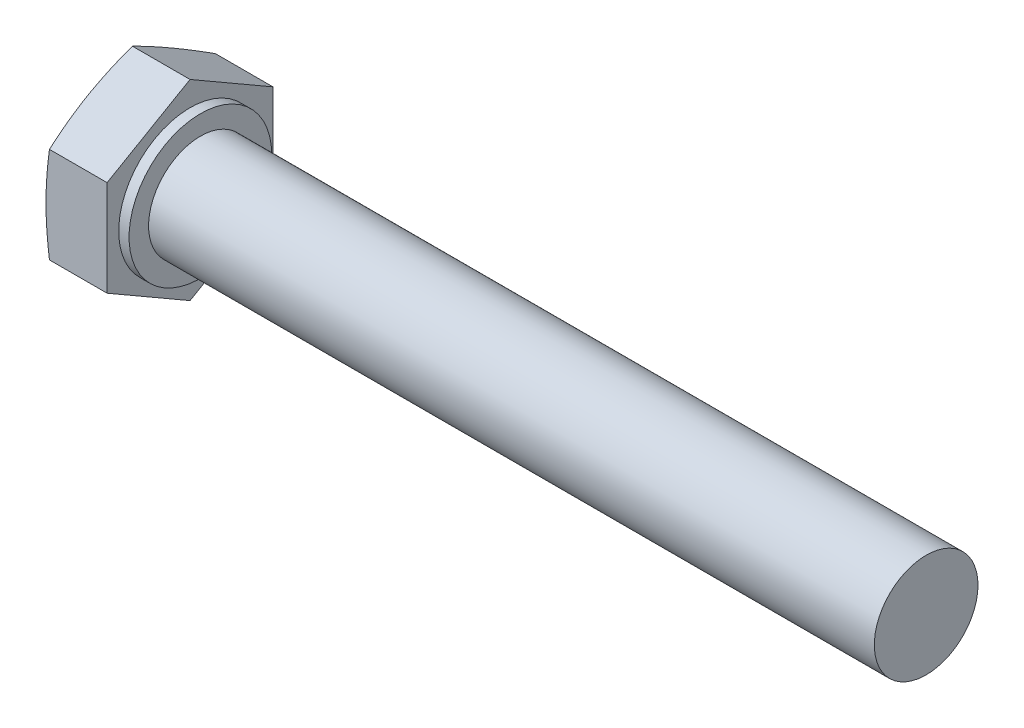
ISO-10303-21;
HEADER;
FILE_DESCRIPTION(('STEP AP214'),'2;1');
FILE_NAME('part.step','',(''),(''),'','','');
FILE_SCHEMA(('AUTOMOTIVE_DESIGN { 1 0 10303 214 1 1 1 1 }'));
ENDSEC;
DATA;
#1=APPLICATION_CONTEXT('core data for automotive mechanical design processes');
#2=APPLICATION_PROTOCOL_DEFINITION('international standard','automotive_design',2000,#1);
#3=PRODUCT_CONTEXT('',#1,'mechanical');
#4=PRODUCT('Part','Part','',(#3));
#5=PRODUCT_RELATED_PRODUCT_CATEGORY('part','',(#4));
#6=PRODUCT_DEFINITION_FORMATION('','',#4);
#7=PRODUCT_DEFINITION_CONTEXT('part definition',#1,'design');
#8=PRODUCT_DEFINITION('design','',#6,#7);
#9=PRODUCT_DEFINITION_SHAPE('','',#8);
#10=(LENGTH_UNIT() NAMED_UNIT(*) SI_UNIT(.MILLI.,.METRE.));
#11=(NAMED_UNIT(*) PLANE_ANGLE_UNIT() SI_UNIT($,.RADIAN.));
#12=(NAMED_UNIT(*) SI_UNIT($,.STERADIAN.) SOLID_ANGLE_UNIT());
#13=UNCERTAINTY_MEASURE_WITH_UNIT(LENGTH_MEASURE(1.E-05),#10,'distance_accuracy_value','');
#14=(GEOMETRIC_REPRESENTATION_CONTEXT(3) GLOBAL_UNCERTAINTY_ASSIGNED_CONTEXT((#13)) GLOBAL_UNIT_ASSIGNED_CONTEXT((#10,
#11,#12)) REPRESENTATION_CONTEXT('',''));
#15=CARTESIAN_POINT('',(0.,0.,0.));
#16=DIRECTION('',(0.,0.,1.));
#17=DIRECTION('',(1.,0.,0.));
#18=AXIS2_PLACEMENT_3D('',#15,#16,#17);
#19=CARTESIAN_POINT('',(-3.5,2.3094010767585,-4.));
#20=DIRECTION('',(0.,0.866025403784439,-0.5));
#21=DIRECTION('',(0.,0.5,0.866025403784439));
#22=AXIS2_PLACEMENT_3D('',#19,#20,#21);
#23=PLANE('',#22);
#24=DIRECTION('',(1.,0.,0.));
#25=VECTOR('',#24,1.);
#26=CARTESIAN_POINT('',(-3.5,2.3094010767585,-4.));
#27=LINE('',#26,#25);
#28=CARTESIAN_POINT('',(-3.28060262420426,2.3094010767585,-4.));
#29=VERTEX_POINT('',#28);
#30=CARTESIAN_POINT('',(-0.5,2.3094010767585,-4.));
#31=VERTEX_POINT('',#30);
#32=EDGE_CURVE('E48',#29,#31,#27,.T.);
#33=ORIENTED_EDGE('',*,*,#32,.F.);
#34=CARTESIAN_POINT('',(-3.28057168293636,2.30928560670467,-4.0002));
#35=CARTESIAN_POINT('',(-3.30628319177267,2.40519879285123,-3.83407348847834));
#36=CARTESIAN_POINT('',(-3.32962506004491,2.50128588853266,-3.66764575680637));
#37=CARTESIAN_POINT('',(-3.37063460722958,2.69379944202103,-3.33420250101888));
#38=CARTESIAN_POINT('',(-3.38829998105541,2.79022602165644,-3.16718676589026));
#39=CARTESIAN_POINT('',(-3.41692518074919,2.98283386677359,-2.83358019221101));
#40=CARTESIAN_POINT('',(-3.42791914570832,3.07901382964742,-2.66699160984345));
#41=CARTESIAN_POINT('',(-3.44266093500611,3.27149641829105,-2.33360198674029));
#42=CARTESIAN_POINT('',(-3.44641016151378,3.3677990167144,-2.16680099337015));
#43=CARTESIAN_POINT('',(-3.44641016151378,3.56040421356111,-1.83319900662985));
#44=CARTESIAN_POINT('',(-3.44266093500611,3.65670681198446,-1.66639801325971));
#45=CARTESIAN_POINT('',(-3.42791914570832,3.84918940062809,-1.33300839015655));
#46=CARTESIAN_POINT('',(-3.41692518074919,3.94536936350192,-1.16641980778899));
#47=CARTESIAN_POINT('',(-3.38829998105541,4.13797720861907,-0.832813234109738));
#48=CARTESIAN_POINT('',(-3.37063460722958,4.23440378825448,-0.665797498981121));
#49=CARTESIAN_POINT('',(-3.32962506004491,4.42691734174285,-0.332354243193628));
#50=CARTESIAN_POINT('',(-3.30628319177267,4.52300443742428,-0.165926511521664));
#51=CARTESIAN_POINT('',(-3.28057168293636,4.61891762357084,0.000199999999998574));
#52=B_SPLINE_CURVE_WITH_KNOTS('',3,(#34,#35,#36,#37,#38,#39,#40,#41,#42,#43,#44,#45,#46,#47,#48,
#49,#50,#51),.UNSPECIFIED.,.F.,.F.,(4,2,2,2,2,2,2,2,4),(0.,0.580655908162845,1.1615473094924,
1.73944052622642,2.31722188451987,2.89500324281333,3.47289645954735,4.0537878608769,
4.63444376903975),.UNSPECIFIED.);
#53=CARTESIAN_POINT('',(-3.28060262420426,4.61880215351701,0.));
#54=VERTEX_POINT('',#53);
#55=EDGE_CURVE('E95',#29,#54,#52,.T.);
#56=ORIENTED_EDGE('',*,*,#55,.T.);
#57=DIRECTION('',(1.,0.,0.));
#58=VECTOR('',#57,1.);
#59=CARTESIAN_POINT('',(-3.5,4.61880215351701,0.));
#60=LINE('',#59,#58);
#61=CARTESIAN_POINT('',(-0.5,4.61880215351701,0.));
#62=VERTEX_POINT('',#61);
#63=EDGE_CURVE('E63',#54,#62,#60,.T.);
#64=ORIENTED_EDGE('',*,*,#63,.T.);
#65=DIRECTION('',(0.,0.5,0.866025403784439));
#66=VECTOR('',#65,1.);
#67=CARTESIAN_POINT('',(-0.5,2.3094010767585,-4.));
#68=LINE('',#67,#66);
#69=EDGE_CURVE('E108',#31,#62,#68,.T.);
#70=ORIENTED_EDGE('',*,*,#69,.F.);
#71=EDGE_LOOP('',(#33,#56,#64,#70));
#72=FACE_BOUND('',#71,.T.);
#73=ADVANCED_FACE('F40',(#72),#23,.T.);
#74=CARTESIAN_POINT('',(-3.5,-2.30940107675851,-4.));
#75=DIRECTION('',(0.,0.,-1.));
#76=DIRECTION('',(-1.,0.,0.));
#77=AXIS2_PLACEMENT_3D('',#74,#75,#76);
#78=PLANE('',#77);
#79=DIRECTION('',(1.,0.,0.));
#80=VECTOR('',#79,1.);
#81=CARTESIAN_POINT('',(-3.5,-2.30940107675851,-4.));
#82=LINE('',#81,#80);
#83=CARTESIAN_POINT('',(-3.28060262420426,-2.30940107675851,-4.));
#84=VERTEX_POINT('',#83);
#85=CARTESIAN_POINT('',(-0.5,-2.30940107675851,-4.));
#86=VERTEX_POINT('',#85);
#87=EDGE_CURVE('E117',#84,#86,#82,.T.);
#88=ORIENTED_EDGE('',*,*,#87,.F.);
#89=CARTESIAN_POINT('',(-2.54242296772448,-6.19450055595883,-4.));
#90=CARTESIAN_POINT('',(-2.58350293636184,-6.01195447631861,-4.));
#91=CARTESIAN_POINT('',(-2.62409437755708,-5.82929650652511,-4.));
#92=CARTESIAN_POINT('',(-2.70403618959372,-5.46370160755528,-4.));
#93=CARTESIAN_POINT('',(-2.74338650919709,-5.28076466718801,-4.));
#94=CARTESIAN_POINT('',(-2.82061288933399,-4.91440917568882,-4.));
#95=CARTESIAN_POINT('',(-2.85848761030803,-4.73099034120251,-4.));
#96=CARTESIAN_POINT('',(-2.93236805889945,-4.36377683028752,-4.));
#97=CARTESIAN_POINT('',(-2.9683738015231,-4.17998215688884,-4.));
#98=CARTESIAN_POINT('',(-3.03776003494146,-3.81358269364098,-4.));
#99=CARTESIAN_POINT('',(-3.07116096214708,-3.63098179247356,-4.));
#100=CARTESIAN_POINT('',(-3.1351395630074,-3.26528689590935,-4.));
#101=CARTESIAN_POINT('',(-3.16571729657513,-3.08219291106155,-4.));
#102=CARTESIAN_POINT('',(-3.22337993520747,-2.71546374495367,-4.));
#103=CARTESIAN_POINT('',(-3.25046507601667,-2.53182860107771,-4.));
#104=CARTESIAN_POINT('',(-3.30036049727044,-2.16396918579982,-4.));
#105=CARTESIAN_POINT('',(-3.32317071095993,-1.97974490524391,-4.));
#106=CARTESIAN_POINT('',(-3.36389207458293,-1.60857382481133,-4.));
#107=CARTESIAN_POINT('',(-3.38174301797085,-1.42162032155134,-4.));
#108=CARTESIAN_POINT('',(-3.41132221840281,-1.04723719975704,-4.));
#109=CARTESIAN_POINT('',(-3.42305100287081,-0.859807623634823,-4.));
#110=CARTESIAN_POINT('',(-3.43970526726239,-0.484736234371589,-4.));
#111=CARTESIAN_POINT('',(-3.44463422127198,-0.297094578664732,-4.));
#112=CARTESIAN_POINT('',(-3.44738413448879,0.0782414787551424,-4.));
#113=CARTESIAN_POINT('',(-3.44520511002843,0.265935880345971,-4.));
#114=CARTESIAN_POINT('',(-3.43385559854323,0.641953509415714,-4.));
#115=CARTESIAN_POINT('',(-3.42465372128836,0.830275769937762,-4.));
#116=CARTESIAN_POINT('',(-3.39978423447399,1.20649467593329,-4.));
#117=CARTESIAN_POINT('',(-3.384116280345,1.39439129818841,-4.));
#118=CARTESIAN_POINT('',(-3.34712727739868,1.76975591537663,-4.));
#119=CARTESIAN_POINT('',(-3.32580214236033,1.95722350129435,-4.));
#120=CARTESIAN_POINT('',(-3.27841255006187,2.33155007459579,-4.));
#121=CARTESIAN_POINT('',(-3.25234810961397,2.51840906413605,-4.));
#122=CARTESIAN_POINT('',(-3.19098590326798,2.92723180578129,-4.));
#123=CARTESIAN_POINT('',(-3.15487565233511,3.14907267126331,-4.));
#124=CARTESIAN_POINT('',(-3.07839569143199,3.59202225842042,-4.));
#125=CARTESIAN_POINT('',(-3.0380257600053,3.81313094141314,-4.));
#126=CARTESIAN_POINT('',(-2.95399825229451,4.25476216614763,-4.));
#127=CARTESIAN_POINT('',(-2.91034005570785,4.47528458913275,-4.));
#128=CARTESIAN_POINT('',(-2.82048091976259,4.91581233165035,-4.));
#129=CARTESIAN_POINT('',(-2.77427993196126,5.13581764124797,-4.));
#130=CARTESIAN_POINT('',(-2.63269397371177,5.79541241396464,-4.));
#131=CARTESIAN_POINT('',(-2.53436753719149,6.23436892454358,-4.));
#132=CARTESIAN_POINT('',(-2.33284626297541,7.11116292345853,-4.));
#133=CARTESIAN_POINT('',(-2.22965128674601,7.54900037957784,-4.));
#134=CARTESIAN_POINT('',(-2.07321941724081,8.2019190959545,-4.));
#135=CARTESIAN_POINT('',(-2.02120417226442,8.41729403866821,-4.));
#136=CARTESIAN_POINT('',(-1.91652089589083,8.84788218474999,-4.));
#137=CARTESIAN_POINT('',(-1.86385287310711,9.06309539021255,-4.));
#138=CARTESIAN_POINT('',(-1.70503509365201,9.70855381375849,-4.));
#139=CARTESIAN_POINT('',(-1.59807596009713,10.1385998353764,-4.));
#140=CARTESIAN_POINT('',(-1.38283476365834,10.9975050896541,-4.));
#141=CARTESIAN_POINT('',(-1.27455554839738,11.4263650378497,-4.));
#142=CARTESIAN_POINT('',(-1.0568577450625,12.283773872932,-4.));
#143=CARTESIAN_POINT('',(-0.947439212039028,12.7123227737876,-4.));
#144=CARTESIAN_POINT('',(-0.837635426583361,13.1407720403947,-4.));
#145=B_SPLINE_CURVE_WITH_KNOTS('',3,(#89,#90,#91,#92,#93,#94,#95,#96,#97,#98,#99,#100,#101,#102,
#103,#104,#105,#106,#107,#108,#109,#110,#111,#112,#113,#114,#115,#116,#117,#118,#119,#120,#121,
#122,#123,#124,#125,#126,#127,#128,#129,#130,#131,#132,#133,#134,#135,#136,#137,#138,#139,#140,
#141,#142,#143,#144),.UNSPECIFIED.,.F.,.F.,(4,2,2,2,2,2,2,2,2,2,2,2,2,2,2,2,2,2,2,2,2,2,2,2,2,2,
2,4),(0.,0.561336053840109,1.12269525143337,1.68455271350249,2.24640566364525,2.80327971560495,
3.3601419470213,3.91696657140627,4.47379989015547,5.03712406917357,5.60039970980468,
6.16338746184165,6.72637392026865,7.29189161920285,7.85743945779006,8.42339691304557,
8.9893523606616,9.66357810344306,10.3378389158198,11.0122272417341,11.6866284198726,
13.0360781533376,14.3855663083892,15.0502664732297,15.7149578765742,17.0443962364937,
18.3713487629595,19.6982374675147),.UNSPECIFIED.);
#146=EDGE_CURVE('E103',#84,#29,#145,.T.);
#147=ORIENTED_EDGE('',*,*,#146,.T.);
#148=ORIENTED_EDGE('',*,*,#32,.T.);
#149=DIRECTION('',(0.,1.,0.));
#150=VECTOR('',#149,1.);
#151=CARTESIAN_POINT('',(-0.5,-2.30940107675851,-4.));
#152=LINE('',#151,#150);
#153=EDGE_CURVE('E111',#86,#31,#152,.T.);
#154=ORIENTED_EDGE('',*,*,#153,.F.);
#155=EDGE_LOOP('',(#88,#147,#148,#154));
#156=FACE_BOUND('',#155,.T.);
#157=ADVANCED_FACE('F187',(#156),#78,.T.);
#158=CARTESIAN_POINT('',(-3.5,-4.61880215351701,0.));
#159=DIRECTION('',(0.,-0.866025403784439,-0.5));
#160=DIRECTION('',(0.,0.5,-0.866025403784439));
#161=AXIS2_PLACEMENT_3D('',#158,#159,#160);
#162=PLANE('',#161);
#163=DIRECTION('',(1.,0.,0.));
#164=VECTOR('',#163,1.);
#165=CARTESIAN_POINT('',(-3.5,-4.61880215351701,0.));
#166=LINE('',#165,#164);
#167=CARTESIAN_POINT('',(-3.28060262420426,-4.61880215351701,0.));
#168=VERTEX_POINT('',#167);
#169=CARTESIAN_POINT('',(-0.5,-4.61880215351701,0.));
#170=VERTEX_POINT('',#169);
#171=EDGE_CURVE('E115',#168,#170,#166,.T.);
#172=ORIENTED_EDGE('',*,*,#171,.F.);
#173=CARTESIAN_POINT('',(-3.28057168293636,-4.61891762357084,0.000199999999999331));
#174=CARTESIAN_POINT('',(-3.30628319177267,-4.52300443742428,-0.165926511521663));
#175=CARTESIAN_POINT('',(-3.32962506004491,-4.42691734174285,-0.332354243193628));
#176=CARTESIAN_POINT('',(-3.37063460722958,-4.23440378825448,-0.66579749898112));
#177=CARTESIAN_POINT('',(-3.38829998105541,-4.13797720861907,-0.832813234109737));
#178=CARTESIAN_POINT('',(-3.41692518074919,-3.94536936350192,-1.16641980778899));
#179=CARTESIAN_POINT('',(-3.42791914570832,-3.84918940062809,-1.33300839015655));
#180=CARTESIAN_POINT('',(-3.44266093500611,-3.65670681198446,-1.66639801325971));
#181=CARTESIAN_POINT('',(-3.44641016151378,-3.56040421356111,-1.83319900662985));
#182=CARTESIAN_POINT('',(-3.44641016151378,-3.36779901671441,-2.16680099337015));
#183=CARTESIAN_POINT('',(-3.44266093500611,-3.27149641829105,-2.33360198674029));
#184=CARTESIAN_POINT('',(-3.42791914570832,-3.07901382964742,-2.66699160984345));
#185=CARTESIAN_POINT('',(-3.41692518074919,-2.98283386677359,-2.83358019221101));
#186=CARTESIAN_POINT('',(-3.38829998105541,-2.79022602165645,-3.16718676589026));
#187=CARTESIAN_POINT('',(-3.37063460722958,-2.69379944202104,-3.33420250101888));
#188=CARTESIAN_POINT('',(-3.32962506004491,-2.50128588853266,-3.66764575680637));
#189=CARTESIAN_POINT('',(-3.30628319177267,-2.40519879285123,-3.83407348847834));
#190=CARTESIAN_POINT('',(-3.28057168293636,-2.30928560670467,-4.0002));
#191=B_SPLINE_CURVE_WITH_KNOTS('',3,(#173,#174,#175,#176,#177,#178,#179,#180,#181,#182,#183,
#184,#185,#186,#187,#188,#189,#190),.UNSPECIFIED.,.F.,.F.,(4,2,2,2,2,2,2,2,4),(0.,
0.580655908162845,1.1615473094924,1.73944052622642,2.31722188451987,2.89500324281333,
3.47289645954735,4.0537878608769,4.63444376903975),.UNSPECIFIED.);
#192=EDGE_CURVE('E177',#168,#84,#191,.T.);
#193=ORIENTED_EDGE('',*,*,#192,.T.);
#194=ORIENTED_EDGE('',*,*,#87,.T.);
#195=DIRECTION('',(0.,0.5,-0.866025403784439));
#196=VECTOR('',#195,1.);
#197=CARTESIAN_POINT('',(-0.5,-4.61880215351701,0.));
#198=LINE('',#197,#196);
#199=EDGE_CURVE('E122',#170,#86,#198,.T.);
#200=ORIENTED_EDGE('',*,*,#199,.F.);
#201=EDGE_LOOP('',(#172,#193,#194,#200));
#202=FACE_BOUND('',#201,.T.);
#203=ADVANCED_FACE('F183',(#202),#162,.T.);
#204=CARTESIAN_POINT('',(-3.5,-2.3094010767585,4.));
#205=DIRECTION('',(0.,-0.866025403784439,0.5));
#206=DIRECTION('',(0.,-0.5,-0.866025403784439));
#207=AXIS2_PLACEMENT_3D('',#204,#205,#206);
#208=PLANE('',#207);
#209=DIRECTION('',(1.,0.,0.));
#210=VECTOR('',#209,1.);
#211=CARTESIAN_POINT('',(-3.5,-2.3094010767585,4.));
#212=LINE('',#211,#210);
#213=CARTESIAN_POINT('',(-3.28060262420426,-2.3094010767585,4.));
#214=VERTEX_POINT('',#213);
#215=CARTESIAN_POINT('',(-0.5,-2.3094010767585,4.));
#216=VERTEX_POINT('',#215);
#217=EDGE_CURVE('E109',#214,#216,#212,.T.);
#218=ORIENTED_EDGE('',*,*,#217,.F.);
#219=CARTESIAN_POINT('',(-3.28057168293636,-2.30928560670467,4.0002));
#220=CARTESIAN_POINT('',(-3.30628319177267,-2.40519879285123,3.83407348847834));
#221=CARTESIAN_POINT('',(-3.32962506004491,-2.50128588853266,3.66764575680637));
#222=CARTESIAN_POINT('',(-3.37063460722958,-2.69379944202103,3.33420250101888));
#223=CARTESIAN_POINT('',(-3.38829998105541,-2.79022602165644,3.16718676589026));
#224=CARTESIAN_POINT('',(-3.41692518074919,-2.98283386677359,2.83358019221101));
#225=CARTESIAN_POINT('',(-3.42791914570832,-3.07901382964742,2.66699160984345));
#226=CARTESIAN_POINT('',(-3.44266093500611,-3.27149641829105,2.33360198674029));
#227=CARTESIAN_POINT('',(-3.44641016151378,-3.3677990167144,2.16680099337015));
#228=CARTESIAN_POINT('',(-3.44641016151378,-3.56040421356111,1.83319900662985));
#229=CARTESIAN_POINT('',(-3.44266093500611,-3.65670681198446,1.66639801325971));
#230=CARTESIAN_POINT('',(-3.42791914570832,-3.84918940062809,1.33300839015655));
#231=CARTESIAN_POINT('',(-3.41692518074919,-3.94536936350192,1.16641980778899));
#232=CARTESIAN_POINT('',(-3.38829998105541,-4.13797720861907,0.832813234109736));
#233=CARTESIAN_POINT('',(-3.37063460722958,-4.23440378825448,0.66579749898112));
#234=CARTESIAN_POINT('',(-3.32962506004491,-4.42691734174285,0.332354243193626));
#235=CARTESIAN_POINT('',(-3.30628319177267,-4.52300443742428,0.165926511521662));
#236=CARTESIAN_POINT('',(-3.28057168293636,-4.61891762357084,-0.000200000000000443));
#237=B_SPLINE_CURVE_WITH_KNOTS('',3,(#219,#220,#221,#222,#223,#224,#225,#226,#227,#228,#229,
#230,#231,#232,#233,#234,#235,#236),.UNSPECIFIED.,.F.,.F.,(4,2,2,2,2,2,2,2,4),(0.,
0.580655908162846,1.1615473094924,1.73944052622642,2.31722188451988,2.89500324281333,
3.47289645954735,4.05378786087691,4.63444376903975),.UNSPECIFIED.);
#238=EDGE_CURVE('E172',#214,#168,#237,.T.);
#239=ORIENTED_EDGE('',*,*,#238,.T.);
#240=ORIENTED_EDGE('',*,*,#171,.T.);
#241=DIRECTION('',(0.,-0.5,-0.866025403784439));
#242=VECTOR('',#241,1.);
#243=CARTESIAN_POINT('',(-0.5,-2.3094010767585,4.));
#244=LINE('',#243,#242);
#245=EDGE_CURVE('E125',#216,#170,#244,.T.);
#246=ORIENTED_EDGE('',*,*,#245,.F.);
#247=EDGE_LOOP('',(#218,#239,#240,#246));
#248=FACE_BOUND('',#247,.T.);
#249=ADVANCED_FACE('F186',(#248),#208,.T.);
#250=CARTESIAN_POINT('',(-3.5,2.3094010767585,4.));
#251=DIRECTION('',(0.,0.,1.));
#252=DIRECTION('',(1.,0.,0.));
#253=AXIS2_PLACEMENT_3D('',#250,#251,#252);
#254=PLANE('',#253);
#255=DIRECTION('',(1.,0.,0.));
#256=VECTOR('',#255,1.);
#257=CARTESIAN_POINT('',(-3.5,2.3094010767585,4.));
#258=LINE('',#257,#256);
#259=CARTESIAN_POINT('',(-3.28060262420426,2.3094010767585,4.));
#260=VERTEX_POINT('',#259);
#261=CARTESIAN_POINT('',(-0.5,2.3094010767585,4.));
#262=VERTEX_POINT('',#261);
#263=EDGE_CURVE('E107',#260,#262,#258,.T.);
#264=ORIENTED_EDGE('',*,*,#263,.F.);
#265=CARTESIAN_POINT('',(-2.54242296772448,-6.19450055595882,4.));
#266=CARTESIAN_POINT('',(-2.58350293636184,-6.01195447631861,4.));
#267=CARTESIAN_POINT('',(-2.62409437755708,-5.82929650652511,4.));
#268=CARTESIAN_POINT('',(-2.70403618959373,-5.46370160755527,4.));
#269=CARTESIAN_POINT('',(-2.74338650919709,-5.28076466718801,4.));
#270=CARTESIAN_POINT('',(-2.82061288933399,-4.91440917568882,4.));
#271=CARTESIAN_POINT('',(-2.85848761030803,-4.7309903412025,4.));
#272=CARTESIAN_POINT('',(-2.93236805889945,-4.36377683028752,4.));
#273=CARTESIAN_POINT('',(-2.9683738015231,-4.17998215688883,4.));
#274=CARTESIAN_POINT('',(-3.03776003494147,-3.81358269364097,4.));
#275=CARTESIAN_POINT('',(-3.07116096214709,-3.63098179247356,4.));
#276=CARTESIAN_POINT('',(-3.1351395630074,-3.26528689590935,4.));
#277=CARTESIAN_POINT('',(-3.16571729657513,-3.08219291106154,4.));
#278=CARTESIAN_POINT('',(-3.22337993520747,-2.71546374495367,4.));
#279=CARTESIAN_POINT('',(-3.25046507601667,-2.53182860107771,4.));
#280=CARTESIAN_POINT('',(-3.30036049727044,-2.16396918579981,4.));
#281=CARTESIAN_POINT('',(-3.32317071095993,-1.9797449052439,4.));
#282=CARTESIAN_POINT('',(-3.36389207458293,-1.60857382481132,4.));
#283=CARTESIAN_POINT('',(-3.38174301797085,-1.42162032155134,4.));
#284=CARTESIAN_POINT('',(-3.41132221840281,-1.04723719975704,4.));
#285=CARTESIAN_POINT('',(-3.42305100287081,-0.859807623634821,4.));
#286=CARTESIAN_POINT('',(-3.43970526726239,-0.484736234371587,4.));
#287=CARTESIAN_POINT('',(-3.44463422127198,-0.29709457866473,4.));
#288=CARTESIAN_POINT('',(-3.44738413448879,0.078241478755144,4.));
#289=CARTESIAN_POINT('',(-3.44520511002843,0.265935880345972,4.));
#290=CARTESIAN_POINT('',(-3.43385559854323,0.641953509415715,4.));
#291=CARTESIAN_POINT('',(-3.42465372128836,0.830275769937763,4.));
#292=CARTESIAN_POINT('',(-3.39978423447399,1.20649467593329,4.));
#293=CARTESIAN_POINT('',(-3.384116280345,1.39439129818841,4.));
#294=CARTESIAN_POINT('',(-3.34712727739868,1.76975591537663,4.));
#295=CARTESIAN_POINT('',(-3.32580214236033,1.95722350129435,4.));
#296=CARTESIAN_POINT('',(-3.27841255006187,2.33155007459579,4.));
#297=CARTESIAN_POINT('',(-3.25234810961397,2.51840906413605,4.));
#298=CARTESIAN_POINT('',(-3.19098590326798,2.92723180578129,4.));
#299=CARTESIAN_POINT('',(-3.15487565233511,3.14907267126331,4.));
#300=CARTESIAN_POINT('',(-3.07839569143199,3.59202225842042,4.));
#301=CARTESIAN_POINT('',(-3.0380257600053,3.81313094141314,4.));
#302=CARTESIAN_POINT('',(-2.95399825229451,4.25476216614763,4.));
#303=CARTESIAN_POINT('',(-2.91034005570785,4.47528458913275,4.));
#304=CARTESIAN_POINT('',(-2.82048091976259,4.91581233165035,4.));
#305=CARTESIAN_POINT('',(-2.77427993196126,5.13581764124797,4.));
#306=CARTESIAN_POINT('',(-2.63269397371177,5.79541241396463,4.));
#307=CARTESIAN_POINT('',(-2.53436753719149,6.23436892454358,4.));
#308=CARTESIAN_POINT('',(-2.33284626297541,7.11116292345852,4.));
#309=CARTESIAN_POINT('',(-2.22965128674601,7.54900037957783,4.));
#310=CARTESIAN_POINT('',(-2.07321941724081,8.2019190959545,4.));
#311=CARTESIAN_POINT('',(-2.02120417226442,8.4172940386682,4.));
#312=CARTESIAN_POINT('',(-1.91652089589083,8.84788218474998,4.));
#313=CARTESIAN_POINT('',(-1.86385287310711,9.06309539021255,4.));
#314=CARTESIAN_POINT('',(-1.70503509365201,9.70855381375849,4.));
#315=CARTESIAN_POINT('',(-1.59807596009713,10.1385998353764,4.));
#316=CARTESIAN_POINT('',(-1.38283476365834,10.9975050896541,4.));
#317=CARTESIAN_POINT('',(-1.27455554839738,11.4263650378497,4.));
#318=CARTESIAN_POINT('',(-1.0568577450625,12.283773872932,4.));
#319=CARTESIAN_POINT('',(-0.94743921203903,12.7123227737876,4.));
#320=CARTESIAN_POINT('',(-0.837635426583363,13.1407720403947,4.));
#321=B_SPLINE_CURVE_WITH_KNOTS('',3,(#265,#266,#267,#268,#269,#270,#271,#272,#273,#274,#275,
#276,#277,#278,#279,#280,#281,#282,#283,#284,#285,#286,#287,#288,#289,#290,#291,#292,#293,#294,
#295,#296,#297,#298,#299,#300,#301,#302,#303,#304,#305,#306,#307,#308,#309,#310,#311,#312,#313,
#314,#315,#316,#317,#318,#319,#320),.UNSPECIFIED.,.F.,.F.,(4,2,2,2,2,2,2,2,2,2,2,2,2,2,2,2,2,2,
2,2,2,2,2,2,2,2,2,4),(0.,0.561336053840109,1.12269525143337,1.68455271350249,2.24640566364525,
2.80327971560495,3.3601419470213,3.91696657140627,4.47379989015547,5.03712406917357,
5.60039970980467,6.16338746184164,6.72637392026864,7.29189161920285,7.85743945779005,
8.42339691304556,8.9893523606616,9.66357810344306,10.3378389158198,11.0122272417341,
11.6866284198726,13.0360781533376,14.3855663083892,15.0502664732297,15.7149578765742,
17.0443962364937,18.3713487629595,19.6982374675147),.UNSPECIFIED.);
#322=EDGE_CURVE('E55',#260,#214,#321,.F.);
#323=ORIENTED_EDGE('',*,*,#322,.T.);
#324=ORIENTED_EDGE('',*,*,#217,.T.);
#325=DIRECTION('',(0.,-1.,0.));
#326=VECTOR('',#325,1.);
#327=CARTESIAN_POINT('',(-0.5,2.3094010767585,4.));
#328=LINE('',#327,#326);
#329=EDGE_CURVE('E128',#262,#216,#328,.T.);
#330=ORIENTED_EDGE('',*,*,#329,.F.);
#331=EDGE_LOOP('',(#264,#323,#324,#330));
#332=FACE_BOUND('',#331,.T.);
#333=ADVANCED_FACE('F193',(#332),#254,.T.);
#334=CARTESIAN_POINT('',(-3.5,4.61880215351701,0.));
#335=DIRECTION('',(0.,0.866025403784439,0.5));
#336=DIRECTION('',(0.,-0.5,0.866025403784439));
#337=AXIS2_PLACEMENT_3D('',#334,#335,#336);
#338=PLANE('',#337);
#339=ORIENTED_EDGE('',*,*,#63,.F.);
#340=CARTESIAN_POINT('',(-3.28057168293636,4.61891762357084,-0.000200000000000924));
#341=CARTESIAN_POINT('',(-3.30628319177267,4.52300443742428,0.165926511521662));
#342=CARTESIAN_POINT('',(-3.32962506004491,4.42691734174285,0.332354243193626));
#343=CARTESIAN_POINT('',(-3.37063460722958,4.23440378825448,0.665797498981119));
#344=CARTESIAN_POINT('',(-3.38829998105541,4.13797720861907,0.832813234109736));
#345=CARTESIAN_POINT('',(-3.41692518074919,3.94536936350192,1.16641980778899));
#346=CARTESIAN_POINT('',(-3.42791914570832,3.84918940062809,1.33300839015655));
#347=CARTESIAN_POINT('',(-3.44266093500611,3.65670681198446,1.66639801325971));
#348=CARTESIAN_POINT('',(-3.44641016151378,3.56040421356111,1.83319900662985));
#349=CARTESIAN_POINT('',(-3.44641016151378,3.3677990167144,2.16680099337015));
#350=CARTESIAN_POINT('',(-3.44266093500611,3.27149641829105,2.33360198674029));
#351=CARTESIAN_POINT('',(-3.42791914570832,3.07901382964742,2.66699160984345));
#352=CARTESIAN_POINT('',(-3.41692518074919,2.98283386677359,2.83358019221101));
#353=CARTESIAN_POINT('',(-3.38829998105541,2.79022602165644,3.16718676589026));
#354=CARTESIAN_POINT('',(-3.37063460722958,2.69379944202103,3.33420250101888));
#355=CARTESIAN_POINT('',(-3.32962506004491,2.50128588853266,3.66764575680637));
#356=CARTESIAN_POINT('',(-3.30628319177267,2.40519879285123,3.83407348847834));
#357=CARTESIAN_POINT('',(-3.28057168293636,2.30928560670467,4.0002));
#358=B_SPLINE_CURVE_WITH_KNOTS('',3,(#340,#341,#342,#343,#344,#345,#346,#347,#348,#349,#350,
#351,#352,#353,#354,#355,#356,#357),.UNSPECIFIED.,.F.,.F.,(4,2,2,2,2,2,2,2,4),(0.,
0.580655908162845,1.1615473094924,1.73944052622642,2.31722188451988,2.89500324281333,
3.47289645954735,4.0537878608769,4.63444376903975),.UNSPECIFIED.);
#359=EDGE_CURVE('E92',#54,#260,#358,.T.);
#360=ORIENTED_EDGE('',*,*,#359,.T.);
#361=ORIENTED_EDGE('',*,*,#263,.T.);
#362=DIRECTION('',(0.,-0.5,0.866025403784439));
#363=VECTOR('',#362,1.);
#364=CARTESIAN_POINT('',(-0.5,4.61880215351701,0.));
#365=LINE('',#364,#363);
#366=EDGE_CURVE('E12',#62,#262,#365,.T.);
#367=ORIENTED_EDGE('',*,*,#366,.F.);
#368=EDGE_LOOP('',(#339,#360,#361,#367));
#369=FACE_BOUND('',#368,.T.);
#370=ADVANCED_FACE('F106',(#369),#338,.T.);
#371=CARTESIAN_POINT('',(0.,4.61880215351701,0.));
#372=DIRECTION('',(1.,0.,0.));
#373=DIRECTION('',(0.,0.,-1.));
#374=AXIS2_PLACEMENT_3D('',#371,#372,#373);
#375=PLANE('',#374);
#376=CARTESIAN_POINT('',(0.,0.,0.));
#377=DIRECTION('',(1.,0.,0.));
#378=DIRECTION('',(0.,0.,-1.));
#379=AXIS2_PLACEMENT_3D('',#376,#377,#378);
#380=CIRCLE('',#379,3.44);
#381=CARTESIAN_POINT('',(0.,0.,-3.44));
#382=VERTEX_POINT('',#381);
#383=EDGE_CURVE('E131',#382,#382,#380,.T.);
#384=ORIENTED_EDGE('',*,*,#383,.T.);
#385=EDGE_LOOP('',(#384));
#386=FACE_BOUND('',#385,.T.);
#387=CARTESIAN_POINT('',(0.,0.,0.));
#388=DIRECTION('',(1.,0.,0.));
#389=DIRECTION('',(0.,0.,-1.));
#390=AXIS2_PLACEMENT_3D('',#387,#388,#389);
#391=CIRCLE('',#390,2.5);
#392=CARTESIAN_POINT('',(0.,0.,-2.5));
#393=VERTEX_POINT('',#392);
#394=EDGE_CURVE('E102',#393,#393,#391,.T.);
#395=ORIENTED_EDGE('',*,*,#394,.F.);
#396=EDGE_LOOP('',(#395));
#397=FACE_BOUND('',#396,.T.);
#398=ADVANCED_FACE('F200',(#386,#397),#375,.T.);
#399=CARTESIAN_POINT('',(-0.5,3.44,0.));
#400=DIRECTION('',(-1.,0.,0.));
#401=DIRECTION('',(0.,0.,1.));
#402=AXIS2_PLACEMENT_3D('',#399,#400,#401);
#403=PLANE('',#402);
#404=ORIENTED_EDGE('',*,*,#69,.T.);
#405=ORIENTED_EDGE('',*,*,#366,.T.);
#406=ORIENTED_EDGE('',*,*,#329,.T.);
#407=ORIENTED_EDGE('',*,*,#245,.T.);
#408=ORIENTED_EDGE('',*,*,#199,.T.);
#409=ORIENTED_EDGE('',*,*,#153,.T.);
#410=EDGE_LOOP('',(#404,#405,#406,#407,#408,#409));
#411=FACE_BOUND('',#410,.T.);
#412=CARTESIAN_POINT('',(-0.5,0.,0.));
#413=DIRECTION('',(1.,0.,0.));
#414=DIRECTION('',(0.,0.,-1.));
#415=AXIS2_PLACEMENT_3D('',#412,#413,#414);
#416=CIRCLE('',#415,3.44);
#417=CARTESIAN_POINT('',(-0.5,0.,-3.44));
#418=VERTEX_POINT('',#417);
#419=EDGE_CURVE('E134',#418,#418,#416,.T.);
#420=ORIENTED_EDGE('',*,*,#419,.F.);
#421=EDGE_LOOP('',(#420));
#422=FACE_BOUND('',#421,.T.);
#423=ADVANCED_FACE('F204',(#411,#422),#403,.F.);
#424=CARTESIAN_POINT('',(0.,0.,0.));
#425=DIRECTION('',(1.,0.,0.));
#426=DIRECTION('',(0.,0.,-1.));
#427=AXIS2_PLACEMENT_3D('',#424,#425,#426);
#428=CYLINDRICAL_SURFACE('',#427,3.44);
#429=ORIENTED_EDGE('',*,*,#383,.F.);
#430=EDGE_LOOP('',(#429));
#431=FACE_BOUND('',#430,.T.);
#432=ORIENTED_EDGE('',*,*,#419,.T.);
#433=EDGE_LOOP('',(#432));
#434=FACE_BOUND('',#433,.T.);
#435=ADVANCED_FACE('F224',(#431,#434),#428,.T.);
#436=CARTESIAN_POINT('',(35.,0.,0.));
#437=DIRECTION('',(-1.,0.,0.));
#438=DIRECTION('',(0.,0.,1.));
#439=AXIS2_PLACEMENT_3D('',#436,#437,#438);
#440=CYLINDRICAL_SURFACE('',#439,2.5);
#441=CARTESIAN_POINT('',(35.,0.,0.));
#442=DIRECTION('',(1.,0.,0.));
#443=DIRECTION('',(0.,0.,-1.));
#444=AXIS2_PLACEMENT_3D('',#441,#442,#443);
#445=CIRCLE('',#444,2.5);
#446=CARTESIAN_POINT('',(35.,0.,-2.5));
#447=VERTEX_POINT('',#446);
#448=EDGE_CURVE('E137',#447,#447,#445,.T.);
#449=ORIENTED_EDGE('',*,*,#448,.F.);
#450=EDGE_LOOP('',(#449));
#451=FACE_BOUND('',#450,.T.);
#452=ORIENTED_EDGE('',*,*,#394,.T.);
#453=EDGE_LOOP('',(#452));
#454=FACE_BOUND('',#453,.T.);
#455=ADVANCED_FACE('F229',(#451,#454),#440,.T.);
#456=CARTESIAN_POINT('',(35.,0.,0.));
#457=DIRECTION('',(1.,0.,0.));
#458=DIRECTION('',(0.,0.,-1.));
#459=AXIS2_PLACEMENT_3D('',#456,#457,#458);
#460=PLANE('',#459);
#461=ORIENTED_EDGE('',*,*,#448,.T.);
#462=EDGE_LOOP('',(#461));
#463=FACE_BOUND('',#462,.T.);
#464=ADVANCED_FACE('F155',(#463),#460,.T.);
#465=CARTESIAN_POINT('',(-3.5,0.,0.));
#466=DIRECTION('',(1.,0.,0.));
#467=DIRECTION('',(0.,0.,1.));
#468=AXIS2_PLACEMENT_3D('',#465,#466,#467);
#469=CONICAL_SURFACE('',#468,3.8,1.30899693899575);
#470=ORIENTED_EDGE('',*,*,#146,.F.);
#471=ORIENTED_EDGE('',*,*,#192,.F.);
#472=ORIENTED_EDGE('',*,*,#238,.F.);
#473=ORIENTED_EDGE('',*,*,#322,.F.);
#474=ORIENTED_EDGE('',*,*,#359,.F.);
#475=ORIENTED_EDGE('',*,*,#55,.F.);
#476=EDGE_LOOP('',(#470,#471,#472,#473,#474,#475));
#477=FACE_BOUND('',#476,.T.);
#478=CARTESIAN_POINT('',(-3.5,0.,0.));
#479=DIRECTION('',(-1.,0.,0.));
#480=DIRECTION('',(0.,0.,1.));
#481=AXIS2_PLACEMENT_3D('',#478,#479,#480);
#482=CIRCLE('',#481,3.8);
#483=CARTESIAN_POINT('',(-3.5,0.,3.8));
#484=VERTEX_POINT('',#483);
#485=EDGE_CURVE('E99',#484,#484,#482,.T.);
#486=ORIENTED_EDGE('',*,*,#485,.F.);
#487=EDGE_LOOP('',(#486));
#488=FACE_BOUND('',#487,.T.);
#489=ADVANCED_FACE('F93',(#477,#488),#469,.T.);
#490=CARTESIAN_POINT('',(-3.5,4.61880215351701,0.));
#491=DIRECTION('',(1.,0.,0.));
#492=DIRECTION('',(0.,0.,-1.));
#493=AXIS2_PLACEMENT_3D('',#490,#491,#492);
#494=PLANE('',#493);
#495=ORIENTED_EDGE('',*,*,#485,.T.);
#496=EDGE_LOOP('',(#495));
#497=FACE_BOUND('',#496,.T.);
#498=ADVANCED_FACE('F154',(#497),#494,.F.);
#499=CLOSED_SHELL('',(#73,#157,#203,#249,#333,#370,#398,#423,#435,#455,#464,#489,#498));
#500=MANIFOLD_SOLID_BREP('B2',#499);
#501=ADVANCED_BREP_SHAPE_REPRESENTATION('',(#18,#500),#14);
#502=SHAPE_DEFINITION_REPRESENTATION(#9,#501);
ENDSEC;
END-ISO-10303-21;
